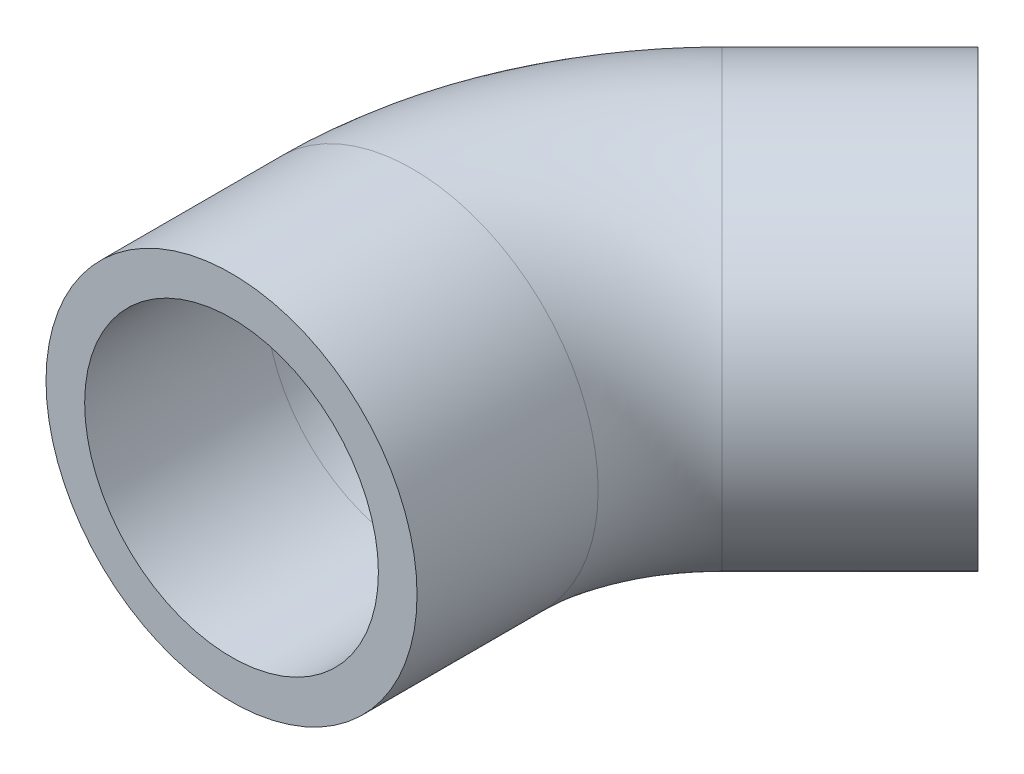
ISO-10303-21;
HEADER;
FILE_DESCRIPTION(('STEP AP214'),'2;1');
FILE_NAME('part.step','',(''),(''),'','','');
FILE_SCHEMA(('AUTOMOTIVE_DESIGN { 1 0 10303 214 1 1 1 1 }'));
ENDSEC;
DATA;
#1=APPLICATION_CONTEXT('core data for automotive mechanical design processes');
#2=APPLICATION_PROTOCOL_DEFINITION('international standard','automotive_design',2000,#1);
#3=PRODUCT_CONTEXT('',#1,'mechanical');
#4=PRODUCT('Part','Part','',(#3));
#5=PRODUCT_RELATED_PRODUCT_CATEGORY('part','',(#4));
#6=PRODUCT_DEFINITION_FORMATION('','',#4);
#7=PRODUCT_DEFINITION_CONTEXT('part definition',#1,'design');
#8=PRODUCT_DEFINITION('design','',#6,#7);
#9=PRODUCT_DEFINITION_SHAPE('','',#8);
#10=(LENGTH_UNIT() NAMED_UNIT(*) SI_UNIT(.MILLI.,.METRE.));
#11=(NAMED_UNIT(*) PLANE_ANGLE_UNIT() SI_UNIT($,.RADIAN.));
#12=(NAMED_UNIT(*) SI_UNIT($,.STERADIAN.) SOLID_ANGLE_UNIT());
#13=UNCERTAINTY_MEASURE_WITH_UNIT(LENGTH_MEASURE(1.E-05),#10,'distance_accuracy_value','');
#14=(GEOMETRIC_REPRESENTATION_CONTEXT(3) GLOBAL_UNCERTAINTY_ASSIGNED_CONTEXT((#13)) GLOBAL_UNIT_ASSIGNED_CONTEXT((#10,
#11,#12)) REPRESENTATION_CONTEXT('',''));
#15=CARTESIAN_POINT('',(0.,0.,0.));
#16=DIRECTION('',(0.,0.,1.));
#17=DIRECTION('',(1.,0.,0.));
#18=AXIS2_PLACEMENT_3D('',#15,#16,#17);
#19=CARTESIAN_POINT('',(14.8789755157234,0.,-65.6789755157234));
#20=DIRECTION('',(0.707106781186548,0.,-0.707106781186546));
#21=DIRECTION('',(-0.707106781186547,0.,-0.707106781186548));
#22=AXIS2_PLACEMENT_3D('',#19,#20,#21);
#23=CYLINDRICAL_SURFACE('',#22,30.48);
#24=CARTESIAN_POINT('',(14.8789755157234,0.,-65.6789755157234));
#25=DIRECTION('',(-0.707106781186549,0.,0.707106781186546));
#26=DIRECTION('',(0.707106781186546,0.,0.707106781186549));
#27=AXIS2_PLACEMENT_3D('',#24,#25,#26);
#28=CIRCLE('',#27,30.48);
#29=CARTESIAN_POINT('',(-6.67363917484249,0.,-87.2315902062894));
#30=VERTEX_POINT('',#29);
#31=EDGE_CURVE('E41',#30,#30,#28,.T.);
#32=ORIENTED_EDGE('',*,*,#31,.F.);
#33=EDGE_LOOP('',(#32));
#34=FACE_BOUND('',#33,.T.);
#35=CARTESIAN_POINT('',(35.9210244842766,0.,-86.7210244842766));
#36=DIRECTION('',(-0.707106781186549,0.,0.707106781186546));
#37=DIRECTION('',(0.707106781186546,0.,0.707106781186549));
#38=AXIS2_PLACEMENT_3D('',#35,#36,#37);
#39=CIRCLE('',#38,30.48);
#40=CARTESIAN_POINT('',(57.4736391748426,0.,-65.1684097937106));
#41=VERTEX_POINT('',#40);
#42=EDGE_CURVE('E10',#41,#41,#39,.T.);
#43=ORIENTED_EDGE('',*,*,#42,.T.);
#44=EDGE_LOOP('',(#43));
#45=FACE_BOUND('',#44,.T.);
#46=ADVANCED_FACE('F31',(#34,#45),#23,.T.);
#47=CARTESIAN_POINT('',(14.8789755157234,0.,-65.6789755157234));
#48=DIRECTION('',(0.707106781186548,0.,-0.707106781186546));
#49=DIRECTION('',(-0.707106781186547,0.,-0.707106781186548));
#50=AXIS2_PLACEMENT_3D('',#47,#48,#49);
#51=CYLINDRICAL_SURFACE('',#50,24.13);
#52=CARTESIAN_POINT('',(14.8789755157234,0.,-65.6789755157234));
#53=DIRECTION('',(-0.707106781186549,0.,0.707106781186546));
#54=DIRECTION('',(0.707106781186546,0.,0.707106781186549));
#55=AXIS2_PLACEMENT_3D('',#52,#53,#54);
#56=CIRCLE('',#55,24.13);
#57=CARTESIAN_POINT('',(-2.18351111430792,0.,-82.7414621457548));
#58=VERTEX_POINT('',#57);
#59=EDGE_CURVE('E45',#58,#58,#56,.T.);
#60=ORIENTED_EDGE('',*,*,#59,.T.);
#61=EDGE_LOOP('',(#60));
#62=FACE_BOUND('',#61,.T.);
#63=CARTESIAN_POINT('',(35.9210244842766,0.,-86.7210244842766));
#64=DIRECTION('',(-0.707106781186549,0.,0.707106781186546));
#65=DIRECTION('',(0.707106781186546,0.,0.707106781186549));
#66=AXIS2_PLACEMENT_3D('',#63,#64,#65);
#67=CIRCLE('',#66,24.13);
#68=CARTESIAN_POINT('',(52.983511114308,0.,-69.6585378542451));
#69=VERTEX_POINT('',#68);
#70=EDGE_CURVE('E37',#69,#69,#67,.T.);
#71=ORIENTED_EDGE('',*,*,#70,.F.);
#72=EDGE_LOOP('',(#71));
#73=FACE_BOUND('',#72,.T.);
#74=ADVANCED_FACE('F88',(#62,#73),#51,.F.);
#75=CARTESIAN_POINT('',(50.8,0.,-29.7579510314467));
#76=DIRECTION('',(0.,-1.,0.));
#77=DIRECTION('',(0.,0.,-1.));
#78=AXIS2_PLACEMENT_3D('',#75,#76,#77);
#79=TOROIDAL_SURFACE('',#78,50.8,30.48);
#80=CARTESIAN_POINT('',(0.,0.,-29.7579510314467));
#81=DIRECTION('',(0.,0.,1.));
#82=DIRECTION('',(1.,0.,0.));
#83=AXIS2_PLACEMENT_3D('',#80,#81,#82);
#84=CIRCLE('',#83,30.48);
#85=CARTESIAN_POINT('',(-30.48,0.,-29.7579510314467));
#86=VERTEX_POINT('',#85);
#87=EDGE_CURVE('E50',#86,#86,#84,.T.);
#88=CARTESIAN_POINT('',(50.8,0.,-29.7579510314467));
#89=DIRECTION('',(0.,-1.,0.));
#90=DIRECTION('',(0.,0.,-1.));
#91=AXIS2_PLACEMENT_3D('',#88,#89,#90);
#92=CIRCLE('',#91,81.28);
#93=EDGE_CURVE('',#86,#30,#92,.T.);
#94=ORIENTED_EDGE('',*,*,#87,.F.);
#95=ORIENTED_EDGE('',*,*,#31,.T.);
#96=ORIENTED_EDGE('',*,*,#93,.T.);
#97=ORIENTED_EDGE('',*,*,#93,.F.);
#98=EDGE_LOOP('',(#94,#96,#95,#97));
#99=FACE_BOUND('',#98,.T.);
#100=ADVANCED_FACE('F93',(#99),#79,.T.);
#101=CARTESIAN_POINT('',(50.8,0.,-29.7579510314467));
#102=DIRECTION('',(0.,-1.,0.));
#103=DIRECTION('',(0.,0.,-1.));
#104=AXIS2_PLACEMENT_3D('',#101,#102,#103);
#105=TOROIDAL_SURFACE('',#104,50.8,24.13);
#106=CARTESIAN_POINT('',(0.,0.,-29.7579510314467));
#107=DIRECTION('',(0.,0.,1.));
#108=DIRECTION('',(1.,0.,0.));
#109=AXIS2_PLACEMENT_3D('',#106,#107,#108);
#110=CIRCLE('',#109,24.13);
#111=CARTESIAN_POINT('',(-24.13,0.,-29.7579510314467));
#112=VERTEX_POINT('',#111);
#113=EDGE_CURVE('E54',#112,#112,#110,.T.);
#114=CARTESIAN_POINT('',(50.8,0.,-29.7579510314467));
#115=DIRECTION('',(0.,-1.,0.));
#116=DIRECTION('',(0.,0.,-1.));
#117=AXIS2_PLACEMENT_3D('',#114,#115,#116);
#118=CIRCLE('',#117,74.93);
#119=EDGE_CURVE('',#112,#58,#118,.T.);
#120=ORIENTED_EDGE('',*,*,#113,.T.);
#121=ORIENTED_EDGE('',*,*,#59,.F.);
#122=ORIENTED_EDGE('',*,*,#119,.T.);
#123=ORIENTED_EDGE('',*,*,#119,.F.);
#124=EDGE_LOOP('',(#120,#122,#121,#123));
#125=FACE_BOUND('',#124,.T.);
#126=ADVANCED_FACE('F63',(#125),#105,.F.);
#127=CARTESIAN_POINT('',(0.,0.,-29.7579510314467));
#128=DIRECTION('',(0.,0.,1.));
#129=DIRECTION('',(1.,0.,0.));
#130=AXIS2_PLACEMENT_3D('',#127,#128,#129);
#131=CYLINDRICAL_SURFACE('',#130,24.13);
#132=ORIENTED_EDGE('',*,*,#113,.F.);
#133=EDGE_LOOP('',(#132));
#134=FACE_BOUND('',#133,.T.);
#135=CARTESIAN_POINT('',(0.,0.,0.));
#136=DIRECTION('',(0.,0.,1.));
#137=DIRECTION('',(1.,0.,0.));
#138=AXIS2_PLACEMENT_3D('',#135,#136,#137);
#139=CIRCLE('',#138,24.13);
#140=CARTESIAN_POINT('',(24.13,0.,0.));
#141=VERTEX_POINT('',#140);
#142=EDGE_CURVE('E55',#141,#141,#139,.T.);
#143=ORIENTED_EDGE('',*,*,#142,.T.);
#144=EDGE_LOOP('',(#143));
#145=FACE_BOUND('',#144,.T.);
#146=ADVANCED_FACE('F66',(#134,#145),#131,.F.);
#147=CARTESIAN_POINT('',(0.,0.,-29.7579510314467));
#148=DIRECTION('',(0.,0.,1.));
#149=DIRECTION('',(1.,0.,0.));
#150=AXIS2_PLACEMENT_3D('',#147,#148,#149);
#151=CYLINDRICAL_SURFACE('',#150,30.48);
#152=ORIENTED_EDGE('',*,*,#87,.T.);
#153=EDGE_LOOP('',(#152));
#154=FACE_BOUND('',#153,.T.);
#155=CARTESIAN_POINT('',(0.,0.,0.));
#156=DIRECTION('',(0.,0.,1.));
#157=DIRECTION('',(1.,0.,0.));
#158=AXIS2_PLACEMENT_3D('',#155,#156,#157);
#159=CIRCLE('',#158,30.48);
#160=CARTESIAN_POINT('',(30.48,0.,0.));
#161=VERTEX_POINT('',#160);
#162=EDGE_CURVE('E51',#161,#161,#159,.T.);
#163=ORIENTED_EDGE('',*,*,#162,.F.);
#164=EDGE_LOOP('',(#163));
#165=FACE_BOUND('',#164,.T.);
#166=ADVANCED_FACE('F69',(#154,#165),#151,.T.);
#167=CARTESIAN_POINT('',(35.9210244842766,0.,-86.7210244842766));
#168=DIRECTION('',(-0.707106781186549,0.,0.707106781186546));
#169=DIRECTION('',(0.707106781186546,0.,0.707106781186549));
#170=AXIS2_PLACEMENT_3D('',#167,#168,#169);
#171=PLANE('',#170);
#172=ORIENTED_EDGE('',*,*,#70,.T.);
#173=EDGE_LOOP('',(#172));
#174=FACE_BOUND('',#173,.T.);
#175=ORIENTED_EDGE('',*,*,#42,.F.);
#176=EDGE_LOOP('',(#175));
#177=FACE_BOUND('',#176,.T.);
#178=ADVANCED_FACE('F76',(#174,#177),#171,.F.);
#179=CARTESIAN_POINT('',(0.,0.,0.));
#180=DIRECTION('',(0.,0.,1.));
#181=DIRECTION('',(1.,0.,0.));
#182=AXIS2_PLACEMENT_3D('',#179,#180,#181);
#183=PLANE('',#182);
#184=ORIENTED_EDGE('',*,*,#142,.F.);
#185=EDGE_LOOP('',(#184));
#186=FACE_BOUND('',#185,.T.);
#187=ORIENTED_EDGE('',*,*,#162,.T.);
#188=EDGE_LOOP('',(#187));
#189=FACE_BOUND('',#188,.T.);
#190=ADVANCED_FACE('F73',(#186,#189),#183,.T.);
#191=CLOSED_SHELL('',(#46,#74,#100,#126,#146,#166,#178,#190));
#192=MANIFOLD_SOLID_BREP('B2',#191);
#193=ADVANCED_BREP_SHAPE_REPRESENTATION('',(#18,#192),#14);
#194=SHAPE_DEFINITION_REPRESENTATION(#9,#193);
ENDSEC;
END-ISO-10303-21;
